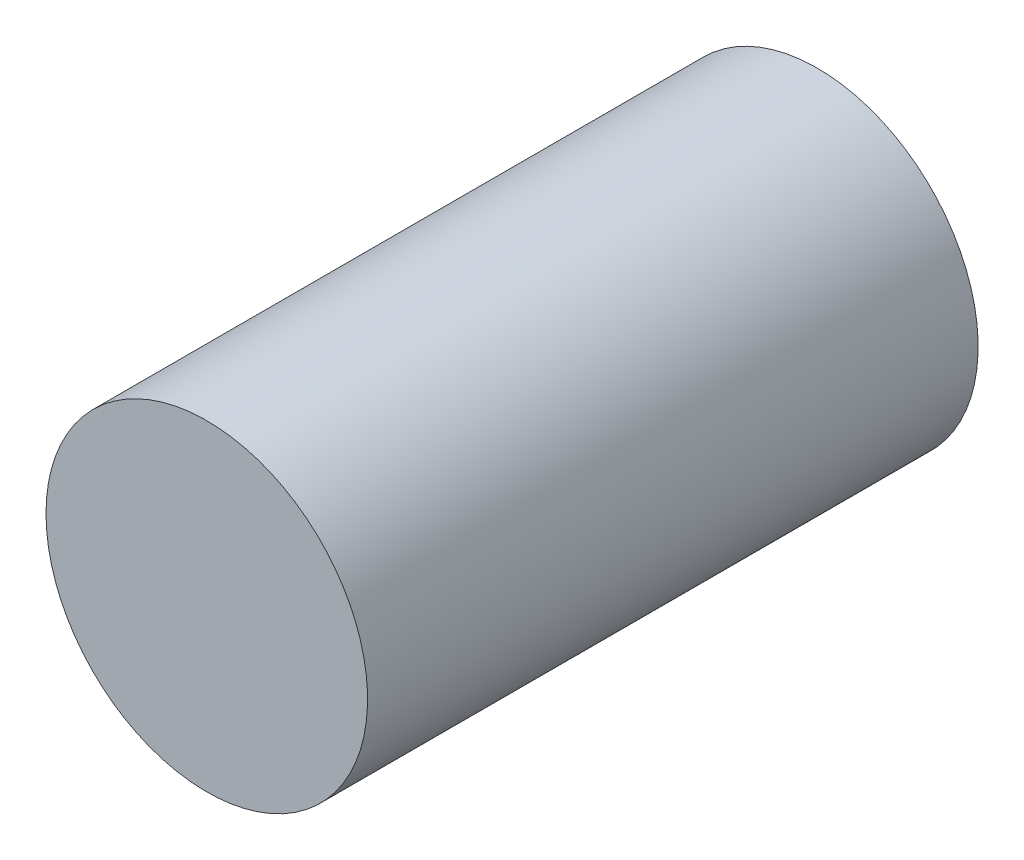
ISO-10303-21;
HEADER;
FILE_DESCRIPTION(('STEP AP214'),'2;1');
FILE_NAME('part.step','',(''),(''),'','','');
FILE_SCHEMA(('AUTOMOTIVE_DESIGN { 1 0 10303 214 1 1 1 1 }'));
ENDSEC;
DATA;
#1=APPLICATION_CONTEXT('core data for automotive mechanical design processes');
#2=APPLICATION_PROTOCOL_DEFINITION('international standard','automotive_design',2000,#1);
#3=PRODUCT_CONTEXT('',#1,'mechanical');
#4=PRODUCT('Part','Part','',(#3));
#5=PRODUCT_RELATED_PRODUCT_CATEGORY('part','',(#4));
#6=PRODUCT_DEFINITION_FORMATION('','',#4);
#7=PRODUCT_DEFINITION_CONTEXT('part definition',#1,'design');
#8=PRODUCT_DEFINITION('design','',#6,#7);
#9=PRODUCT_DEFINITION_SHAPE('','',#8);
#10=(LENGTH_UNIT() NAMED_UNIT(*) SI_UNIT(.MILLI.,.METRE.));
#11=(NAMED_UNIT(*) PLANE_ANGLE_UNIT() SI_UNIT($,.RADIAN.));
#12=(NAMED_UNIT(*) SI_UNIT($,.STERADIAN.) SOLID_ANGLE_UNIT());
#13=UNCERTAINTY_MEASURE_WITH_UNIT(LENGTH_MEASURE(1.E-05),#10,'distance_accuracy_value','');
#14=(GEOMETRIC_REPRESENTATION_CONTEXT(3) GLOBAL_UNCERTAINTY_ASSIGNED_CONTEXT((#13)) GLOBAL_UNIT_ASSIGNED_CONTEXT((#10,
#11,#12)) REPRESENTATION_CONTEXT('',''));
#15=CARTESIAN_POINT('',(0.,0.,0.));
#16=DIRECTION('',(0.,0.,1.));
#17=DIRECTION('',(1.,0.,0.));
#18=AXIS2_PLACEMENT_3D('',#15,#16,#17);
#19=CARTESIAN_POINT('',(0.,0.,152.4));
#20=DIRECTION('',(0.,0.,-1.));
#21=DIRECTION('',(-1.,0.,0.));
#22=AXIS2_PLACEMENT_3D('',#19,#20,#21);
#23=CYLINDRICAL_SURFACE('',#22,40.132);
#24=CARTESIAN_POINT('',(0.,0.,152.4));
#25=DIRECTION('',(0.,0.,1.));
#26=DIRECTION('',(1.,0.,0.));
#27=AXIS2_PLACEMENT_3D('',#24,#25,#26);
#28=CIRCLE('',#27,40.132);
#29=CARTESIAN_POINT('',(-40.132,0.,152.4));
#30=VERTEX_POINT('',#29);
#31=EDGE_CURVE('E10',#30,#30,#28,.T.);
#32=CARTESIAN_POINT('',(0.,0.,0.));
#33=DIRECTION('',(0.,0.,1.));
#34=DIRECTION('',(1.,0.,0.));
#35=AXIS2_PLACEMENT_3D('',#32,#33,#34);
#36=CIRCLE('',#35,40.132);
#37=CARTESIAN_POINT('',(-40.132,0.,0.));
#38=VERTEX_POINT('',#37);
#39=EDGE_CURVE('E40',#38,#38,#36,.T.);
#40=CARTESIAN_POINT('',(-40.132,0.,152.4));
#41=CARTESIAN_POINT('',(-40.132,0.,150.8125));
#42=CARTESIAN_POINT('',(-40.132,0.,149.225));
#43=CARTESIAN_POINT('',(-40.132,0.,146.05));
#44=CARTESIAN_POINT('',(-40.132,0.,144.4625));
#45=CARTESIAN_POINT('',(-40.132,0.,141.2875));
#46=CARTESIAN_POINT('',(-40.132,0.,139.7));
#47=CARTESIAN_POINT('',(-40.132,0.,136.525));
#48=CARTESIAN_POINT('',(-40.132,0.,134.9375));
#49=CARTESIAN_POINT('',(-40.132,0.,131.7625));
#50=CARTESIAN_POINT('',(-40.132,0.,130.175));
#51=CARTESIAN_POINT('',(-40.132,0.,127.));
#52=CARTESIAN_POINT('',(-40.132,0.,125.4125));
#53=CARTESIAN_POINT('',(-40.132,0.,122.2375));
#54=CARTESIAN_POINT('',(-40.132,0.,120.65));
#55=CARTESIAN_POINT('',(-40.132,0.,117.475));
#56=CARTESIAN_POINT('',(-40.132,0.,115.8875));
#57=CARTESIAN_POINT('',(-40.132,0.,112.7125));
#58=CARTESIAN_POINT('',(-40.132,0.,111.125));
#59=CARTESIAN_POINT('',(-40.132,0.,107.95));
#60=CARTESIAN_POINT('',(-40.132,0.,106.3625));
#61=CARTESIAN_POINT('',(-40.132,0.,103.1875));
#62=CARTESIAN_POINT('',(-40.132,0.,101.6));
#63=CARTESIAN_POINT('',(-40.132,0.,98.425));
#64=CARTESIAN_POINT('',(-40.132,0.,96.8375));
#65=CARTESIAN_POINT('',(-40.132,0.,93.6625));
#66=CARTESIAN_POINT('',(-40.132,0.,92.075));
#67=CARTESIAN_POINT('',(-40.132,0.,88.9));
#68=CARTESIAN_POINT('',(-40.132,0.,87.3125));
#69=CARTESIAN_POINT('',(-40.132,0.,84.1375));
#70=CARTESIAN_POINT('',(-40.132,0.,82.55));
#71=CARTESIAN_POINT('',(-40.132,0.,79.375));
#72=CARTESIAN_POINT('',(-40.132,0.,77.7875));
#73=CARTESIAN_POINT('',(-40.132,0.,74.6125));
#74=CARTESIAN_POINT('',(-40.132,0.,73.025));
#75=CARTESIAN_POINT('',(-40.132,0.,69.85));
#76=CARTESIAN_POINT('',(-40.132,0.,68.2625));
#77=CARTESIAN_POINT('',(-40.132,0.,65.0875));
#78=CARTESIAN_POINT('',(-40.132,0.,63.5));
#79=CARTESIAN_POINT('',(-40.132,0.,60.325));
#80=CARTESIAN_POINT('',(-40.132,0.,58.7375));
#81=CARTESIAN_POINT('',(-40.132,0.,55.5625));
#82=CARTESIAN_POINT('',(-40.132,0.,53.975));
#83=CARTESIAN_POINT('',(-40.132,0.,50.8));
#84=CARTESIAN_POINT('',(-40.132,0.,49.2125));
#85=CARTESIAN_POINT('',(-40.132,0.,46.0375));
#86=CARTESIAN_POINT('',(-40.132,0.,44.45));
#87=CARTESIAN_POINT('',(-40.132,0.,41.275));
#88=CARTESIAN_POINT('',(-40.132,0.,39.6875));
#89=CARTESIAN_POINT('',(-40.132,0.,36.5125));
#90=CARTESIAN_POINT('',(-40.132,0.,34.925));
#91=CARTESIAN_POINT('',(-40.132,0.,31.75));
#92=CARTESIAN_POINT('',(-40.132,0.,30.1625));
#93=CARTESIAN_POINT('',(-40.132,0.,26.9875));
#94=CARTESIAN_POINT('',(-40.132,0.,25.4));
#95=CARTESIAN_POINT('',(-40.132,0.,22.225));
#96=CARTESIAN_POINT('',(-40.132,0.,20.6375));
#97=CARTESIAN_POINT('',(-40.132,0.,17.4625));
#98=CARTESIAN_POINT('',(-40.132,0.,15.875));
#99=CARTESIAN_POINT('',(-40.132,0.,12.7));
#100=CARTESIAN_POINT('',(-40.132,0.,11.1125));
#101=CARTESIAN_POINT('',(-40.132,0.,7.93750000000001));
#102=CARTESIAN_POINT('',(-40.132,0.,6.35));
#103=CARTESIAN_POINT('',(-40.132,0.,3.175));
#104=CARTESIAN_POINT('',(-40.132,0.,1.5875));
#105=CARTESIAN_POINT('',(-40.132,0.,0.));
#106=B_SPLINE_CURVE_WITH_KNOTS('',3,(#40,#41,#42,#43,#44,#45,#46,#47,#48,#49,#50,#51,#52,#53,
#54,#55,#56,#57,#58,#59,#60,#61,#62,#63,#64,#65,#66,#67,#68,#69,#70,#71,#72,#73,#74,#75,#76,#77,
#78,#79,#80,#81,#82,#83,#84,#85,#86,#87,#88,#89,#90,#91,#92,#93,#94,#95,#96,#97,#98,#99,#100,
#101,#102,#103,#104,#105),.UNSPECIFIED.,.F.,.F.,(4,2,2,2,2,2,2,2,2,2,2,2,2,2,2,2,2,2,2,2,2,2,2,
2,2,2,2,2,2,2,2,2,4),(0.,4.7625,9.52500000000001,14.2875,19.05,23.8125,28.575,33.3375,38.1,
42.8625,47.625,52.3875,57.15,61.9125,66.675,71.4375,76.2,80.9625,85.725,90.4875,95.25,100.0125,
104.775,109.5375,114.3,119.0625,123.825,128.5875,133.35,138.1125,142.875,147.6375,152.4),.UNSPECIFIED.);
#107=EDGE_CURVE('BSEAM37',#30,#38,#106,.T.);
#108=ORIENTED_EDGE('',*,*,#31,.F.);
#109=ORIENTED_EDGE('',*,*,#39,.T.);
#110=ORIENTED_EDGE('',*,*,#107,.T.);
#111=ORIENTED_EDGE('',*,*,#107,.F.);
#112=EDGE_LOOP('',(#108,#110,#109,#111));
#113=FACE_BOUND('',#112,.T.);
#114=ADVANCED_FACE('F37',(#113),#23,.T.);
#115=CARTESIAN_POINT('',(0.,0.,152.4));
#116=DIRECTION('',(0.,0.,1.));
#117=DIRECTION('',(1.,0.,0.));
#118=AXIS2_PLACEMENT_3D('',#115,#116,#117);
#119=PLANE('',#118);
#120=ORIENTED_EDGE('',*,*,#31,.T.);
#121=EDGE_LOOP('',(#120));
#122=FACE_BOUND('',#121,.T.);
#123=ADVANCED_FACE('F54',(#122),#119,.T.);
#124=CARTESIAN_POINT('',(0.,0.,0.));
#125=DIRECTION('',(0.,0.,1.));
#126=DIRECTION('',(1.,0.,0.));
#127=AXIS2_PLACEMENT_3D('',#124,#125,#126);
#128=PLANE('',#127);
#129=ORIENTED_EDGE('',*,*,#39,.F.);
#130=EDGE_LOOP('',(#129));
#131=FACE_BOUND('',#130,.T.);
#132=ADVANCED_FACE('F52',(#131),#128,.F.);
#133=CLOSED_SHELL('',(#114,#123,#132));
#134=MANIFOLD_SOLID_BREP('B2',#133);
#135=ADVANCED_BREP_SHAPE_REPRESENTATION('',(#18,#134),#14);
#136=SHAPE_DEFINITION_REPRESENTATION(#9,#135);
ENDSEC;
END-ISO-10303-21;
